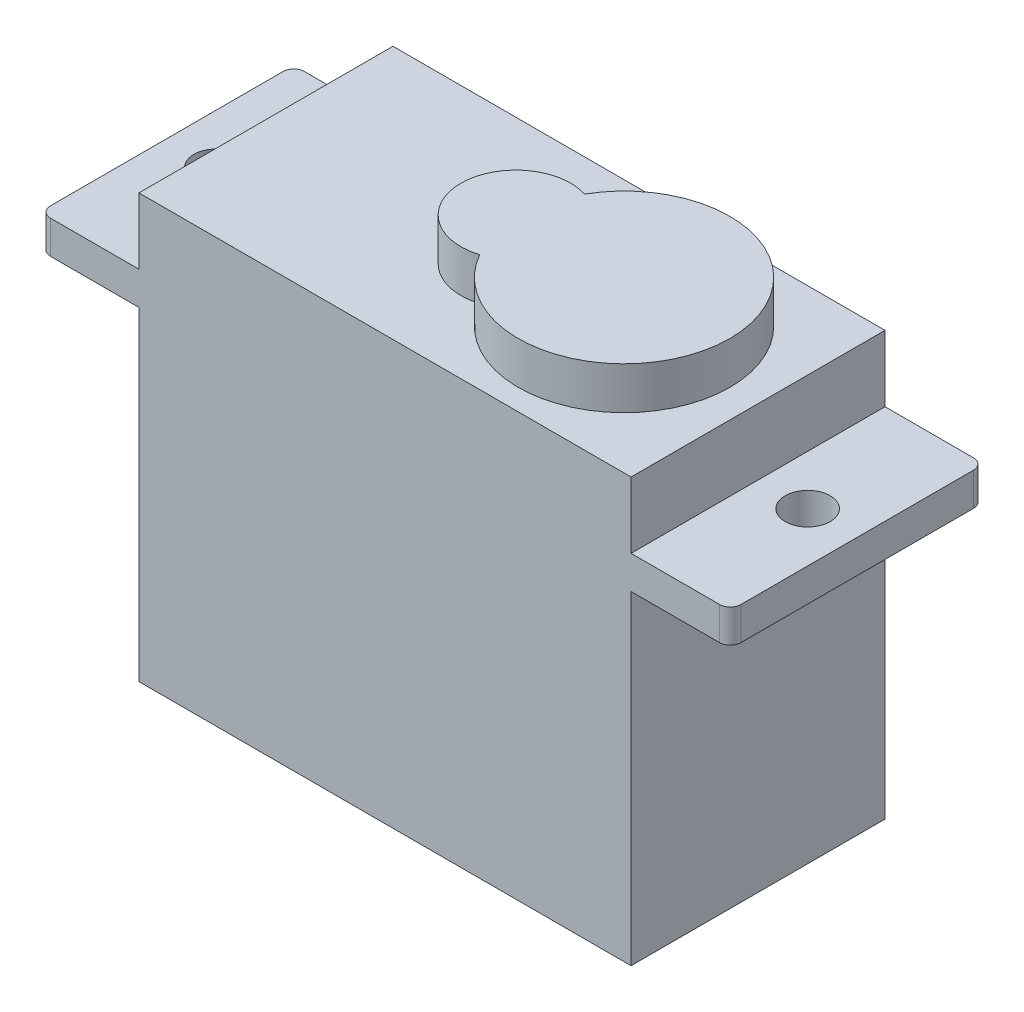
ISO-10303-21;
HEADER;
FILE_DESCRIPTION(('STEP AP214'),'2;1');
FILE_NAME('part.step','',(''),(''),'','','');
FILE_SCHEMA(('AUTOMOTIVE_DESIGN { 1 0 10303 214 1 1 1 1 }'));
ENDSEC;
DATA;
#1=APPLICATION_CONTEXT('core data for automotive mechanical design processes');
#2=APPLICATION_PROTOCOL_DEFINITION('international standard','automotive_design',2000,#1);
#3=PRODUCT_CONTEXT('',#1,'mechanical');
#4=PRODUCT('Part','Part','',(#3));
#5=PRODUCT_RELATED_PRODUCT_CATEGORY('part','',(#4));
#6=PRODUCT_DEFINITION_FORMATION('','',#4);
#7=PRODUCT_DEFINITION_CONTEXT('part definition',#1,'design');
#8=PRODUCT_DEFINITION('design','',#6,#7);
#9=PRODUCT_DEFINITION_SHAPE('','',#8);
#10=(LENGTH_UNIT() NAMED_UNIT(*) SI_UNIT(.MILLI.,.METRE.));
#11=(NAMED_UNIT(*) PLANE_ANGLE_UNIT() SI_UNIT($,.RADIAN.));
#12=(NAMED_UNIT(*) SI_UNIT($,.STERADIAN.) SOLID_ANGLE_UNIT());
#13=UNCERTAINTY_MEASURE_WITH_UNIT(LENGTH_MEASURE(1.E-05),#10,'distance_accuracy_value','');
#14=(GEOMETRIC_REPRESENTATION_CONTEXT(3) GLOBAL_UNCERTAINTY_ASSIGNED_CONTEXT((#13)) GLOBAL_UNIT_ASSIGNED_CONTEXT((#10,
#11,#12)) REPRESENTATION_CONTEXT('',''));
#15=CARTESIAN_POINT('',(0.,0.,0.));
#16=DIRECTION('',(0.,0.,1.));
#17=DIRECTION('',(1.,0.,0.));
#18=AXIS2_PLACEMENT_3D('',#15,#16,#17);
#19=CARTESIAN_POINT('',(-11.811,20.32,-6.096));
#20=DIRECTION('',(1.,0.,0.));
#21=DIRECTION('',(0.,0.,-1.));
#22=AXIS2_PLACEMENT_3D('',#19,#20,#21);
#23=PLANE('',#22);
#24=DIRECTION('',(0.,-1.,0.));
#25=VECTOR('',#24,1.);
#26=CARTESIAN_POINT('',(-11.811,20.32,6.096));
#27=LINE('',#26,#25);
#28=CARTESIAN_POINT('',(-11.811,15.5575,6.096));
#29=VERTEX_POINT('',#28);
#30=CARTESIAN_POINT('',(-11.811,0.,6.096));
#31=VERTEX_POINT('',#30);
#32=EDGE_CURVE('E376',#29,#31,#27,.T.);
#33=ORIENTED_EDGE('',*,*,#32,.F.);
#34=DIRECTION('',(0.,0.,-1.));
#35=VECTOR('',#34,1.);
#36=CARTESIAN_POINT('',(-11.811,15.5575,6.096));
#37=LINE('',#36,#35);
#38=CARTESIAN_POINT('',(-11.811,15.5575,-6.096));
#39=VERTEX_POINT('',#38);
#40=EDGE_CURVE('E196',#29,#39,#37,.T.);
#41=ORIENTED_EDGE('',*,*,#40,.T.);
#42=DIRECTION('',(0.,-1.,0.));
#43=VECTOR('',#42,1.);
#44=CARTESIAN_POINT('',(-11.811,20.32,-6.096));
#45=LINE('',#44,#43);
#46=CARTESIAN_POINT('',(-11.811,0.,-6.096));
#47=VERTEX_POINT('',#46);
#48=EDGE_CURVE('E203',#39,#47,#45,.T.);
#49=ORIENTED_EDGE('',*,*,#48,.T.);
#50=DIRECTION('',(0.,0.,1.));
#51=VECTOR('',#50,1.);
#52=CARTESIAN_POINT('',(-11.811,0.,-6.096));
#53=LINE('',#52,#51);
#54=EDGE_CURVE('E367',#47,#31,#53,.T.);
#55=ORIENTED_EDGE('',*,*,#54,.T.);
#56=EDGE_LOOP('',(#33,#41,#49,#55));
#57=FACE_BOUND('',#56,.T.);
#58=ADVANCED_FACE('F47',(#57),#23,.F.);
#59=CARTESIAN_POINT('',(11.811,20.32,-6.096));
#60=DIRECTION('',(-1.,0.,0.));
#61=DIRECTION('',(0.,0.,1.));
#62=AXIS2_PLACEMENT_3D('',#59,#60,#61);
#63=PLANE('',#62);
#64=DIRECTION('',(0.,0.,1.));
#65=VECTOR('',#64,1.);
#66=CARTESIAN_POINT('',(11.811,17.145,6.096));
#67=LINE('',#66,#65);
#68=CARTESIAN_POINT('',(11.811,17.145,-6.096));
#69=VERTEX_POINT('',#68);
#70=CARTESIAN_POINT('',(11.811,17.145,6.096));
#71=VERTEX_POINT('',#70);
#72=EDGE_CURVE('E300',#69,#71,#67,.T.);
#73=ORIENTED_EDGE('',*,*,#72,.F.);
#74=DIRECTION('',(0.,-1.,0.));
#75=VECTOR('',#74,1.);
#76=CARTESIAN_POINT('',(11.811,20.32,-6.096));
#77=LINE('',#76,#75);
#78=CARTESIAN_POINT('',(11.811,20.32,-6.096));
#79=VERTEX_POINT('',#78);
#80=EDGE_CURVE('E207',#79,#69,#77,.T.);
#81=ORIENTED_EDGE('',*,*,#80,.F.);
#82=DIRECTION('',(0.,0.,-1.));
#83=VECTOR('',#82,1.);
#84=CARTESIAN_POINT('',(11.811,20.32,-6.096));
#85=LINE('',#84,#83);
#86=CARTESIAN_POINT('',(11.811,20.32,6.096));
#87=VERTEX_POINT('',#86);
#88=EDGE_CURVE('E346',#87,#79,#85,.T.);
#89=ORIENTED_EDGE('',*,*,#88,.F.);
#90=DIRECTION('',(0.,-1.,0.));
#91=VECTOR('',#90,1.);
#92=CARTESIAN_POINT('',(11.811,20.32,6.096));
#93=LINE('',#92,#91);
#94=EDGE_CURVE('E373',#87,#71,#93,.T.);
#95=ORIENTED_EDGE('',*,*,#94,.T.);
#96=EDGE_LOOP('',(#73,#81,#89,#95));
#97=FACE_BOUND('',#96,.T.);
#98=ADVANCED_FACE('F416',(#97),#63,.F.);
#99=DIRECTION('',(0.,0.,-1.));
#100=VECTOR('',#99,1.);
#101=CARTESIAN_POINT('',(11.811,15.5575,6.096));
#102=LINE('',#101,#100);
#103=CARTESIAN_POINT('',(11.811,15.5575,6.096));
#104=VERTEX_POINT('',#103);
#105=CARTESIAN_POINT('',(11.811,15.5575,-6.096));
#106=VERTEX_POINT('',#105);
#107=EDGE_CURVE('E294',#104,#106,#102,.T.);
#108=ORIENTED_EDGE('',*,*,#107,.F.);
#109=CARTESIAN_POINT('',(11.811,0.,6.096));
#110=VERTEX_POINT('',#109);
#111=EDGE_CURVE('E359',#104,#110,#93,.T.);
#112=ORIENTED_EDGE('',*,*,#111,.T.);
#113=DIRECTION('',(0.,0.,-1.));
#114=VECTOR('',#113,1.);
#115=CARTESIAN_POINT('',(11.811,0.,-6.096));
#116=LINE('',#115,#114);
#117=CARTESIAN_POINT('',(11.811,0.,-6.096));
#118=VERTEX_POINT('',#117);
#119=EDGE_CURVE('E345',#110,#118,#116,.T.);
#120=ORIENTED_EDGE('',*,*,#119,.T.);
#121=EDGE_CURVE('E202',#106,#118,#77,.T.);
#122=ORIENTED_EDGE('',*,*,#121,.F.);
#123=EDGE_LOOP('',(#108,#112,#120,#122));
#124=FACE_BOUND('',#123,.T.);
#125=ADVANCED_FACE('F386',(#124),#63,.F.);
#126=CARTESIAN_POINT('',(-11.811,20.32,-6.096));
#127=DIRECTION('',(0.,0.,1.));
#128=DIRECTION('',(1.,0.,0.));
#129=AXIS2_PLACEMENT_3D('',#126,#127,#128);
#130=PLANE('',#129);
#131=DIRECTION('',(-1.,0.,0.));
#132=VECTOR('',#131,1.);
#133=CARTESIAN_POINT('',(16.5735,17.145,-6.096));
#134=LINE('',#133,#132);
#135=CARTESIAN_POINT('',(16.0655,17.145,-6.096));
#136=VERTEX_POINT('',#135);
#137=EDGE_CURVE('E313',#136,#69,#134,.T.);
#138=ORIENTED_EDGE('',*,*,#137,.F.);
#139=DIRECTION('',(0.,1.,0.));
#140=VECTOR('',#139,1.);
#141=CARTESIAN_POINT('',(16.0655,15.5575,-6.096));
#142=LINE('',#141,#140);
#143=CARTESIAN_POINT('',(16.0655,15.5575,-6.096));
#144=VERTEX_POINT('',#143);
#145=EDGE_CURVE('E244',#136,#144,#142,.F.);
#146=ORIENTED_EDGE('',*,*,#145,.T.);
#147=DIRECTION('',(-1.,0.,0.));
#148=VECTOR('',#147,1.);
#149=CARTESIAN_POINT('',(16.5735,15.5575,-6.096));
#150=LINE('',#149,#148);
#151=EDGE_CURVE('E316',#144,#106,#150,.T.);
#152=ORIENTED_EDGE('',*,*,#151,.T.);
#153=ORIENTED_EDGE('',*,*,#121,.T.);
#154=DIRECTION('',(-1.,0.,0.));
#155=VECTOR('',#154,1.);
#156=CARTESIAN_POINT('',(-11.811,0.,-6.096));
#157=LINE('',#156,#155);
#158=EDGE_CURVE('E363',#118,#47,#157,.T.);
#159=ORIENTED_EDGE('',*,*,#158,.T.);
#160=ORIENTED_EDGE('',*,*,#48,.F.);
#161=DIRECTION('',(1.,0.,0.));
#162=VECTOR('',#161,1.);
#163=CARTESIAN_POINT('',(-16.5735,15.5575,-6.096));
#164=LINE('',#163,#162);
#165=CARTESIAN_POINT('',(-16.0655,15.5575,-6.096));
#166=VERTEX_POINT('',#165);
#167=EDGE_CURVE('E186',#166,#39,#164,.T.);
#168=ORIENTED_EDGE('',*,*,#167,.F.);
#169=DIRECTION('',(0.,1.,0.));
#170=VECTOR('',#169,1.);
#171=CARTESIAN_POINT('',(-16.0655,17.145,-6.096));
#172=LINE('',#171,#170);
#173=CARTESIAN_POINT('',(-16.0655,17.145,-6.096));
#174=VERTEX_POINT('',#173);
#175=EDGE_CURVE('E182',#166,#174,#172,.T.);
#176=ORIENTED_EDGE('',*,*,#175,.T.);
#177=DIRECTION('',(1.,0.,0.));
#178=VECTOR('',#177,1.);
#179=CARTESIAN_POINT('',(-16.5735,17.145,-6.096));
#180=LINE('',#179,#178);
#181=CARTESIAN_POINT('',(-11.811,17.145,-6.096));
#182=VERTEX_POINT('',#181);
#183=EDGE_CURVE('E173',#174,#182,#180,.T.);
#184=ORIENTED_EDGE('',*,*,#183,.T.);
#185=CARTESIAN_POINT('',(-11.811,20.32,-6.096));
#186=VERTEX_POINT('',#185);
#187=EDGE_CURVE('E178',#186,#182,#45,.T.);
#188=ORIENTED_EDGE('',*,*,#187,.F.);
#189=DIRECTION('',(-1.,0.,0.));
#190=VECTOR('',#189,1.);
#191=CARTESIAN_POINT('',(-11.811,20.32,-6.096));
#192=LINE('',#191,#190);
#193=EDGE_CURVE('E350',#79,#186,#192,.T.);
#194=ORIENTED_EDGE('',*,*,#193,.F.);
#195=ORIENTED_EDGE('',*,*,#80,.T.);
#196=EDGE_LOOP('',(#138,#146,#152,#153,#159,#160,#168,#176,#184,#188,#194,#195));
#197=FACE_BOUND('',#196,.T.);
#198=ADVANCED_FACE('F176',(#197),#130,.F.);
#199=ORIENTED_EDGE('',*,*,#187,.T.);
#200=DIRECTION('',(0.,0.,1.));
#201=VECTOR('',#200,1.);
#202=CARTESIAN_POINT('',(-11.811,17.145,6.096));
#203=LINE('',#202,#201);
#204=CARTESIAN_POINT('',(-11.811,17.145,6.096));
#205=VERTEX_POINT('',#204);
#206=EDGE_CURVE('E189',#182,#205,#203,.T.);
#207=ORIENTED_EDGE('',*,*,#206,.T.);
#208=CARTESIAN_POINT('',(-11.811,20.32,6.096));
#209=VERTEX_POINT('',#208);
#210=EDGE_CURVE('E209',#209,#205,#27,.T.);
#211=ORIENTED_EDGE('',*,*,#210,.F.);
#212=DIRECTION('',(0.,0.,1.));
#213=VECTOR('',#212,1.);
#214=CARTESIAN_POINT('',(-11.811,20.32,-6.096));
#215=LINE('',#214,#213);
#216=EDGE_CURVE('E200',#186,#209,#215,.T.);
#217=ORIENTED_EDGE('',*,*,#216,.F.);
#218=EDGE_LOOP('',(#199,#207,#211,#217));
#219=FACE_BOUND('',#218,.T.);
#220=ADVANCED_FACE('F199',(#219),#23,.F.);
#221=CARTESIAN_POINT('',(-11.811,20.32,6.096));
#222=DIRECTION('',(0.,0.,-1.));
#223=DIRECTION('',(-1.,0.,0.));
#224=AXIS2_PLACEMENT_3D('',#221,#222,#223);
#225=PLANE('',#224);
#226=DIRECTION('',(-1.,0.,0.));
#227=VECTOR('',#226,1.);
#228=CARTESIAN_POINT('',(16.5735,15.5575,6.096));
#229=LINE('',#228,#227);
#230=CARTESIAN_POINT('',(16.0655,15.5575,6.096));
#231=VERTEX_POINT('',#230);
#232=EDGE_CURVE('E319',#231,#104,#229,.T.);
#233=ORIENTED_EDGE('',*,*,#232,.F.);
#234=DIRECTION('',(0.,-1.,0.));
#235=VECTOR('',#234,1.);
#236=CARTESIAN_POINT('',(16.0655,17.145,6.096));
#237=LINE('',#236,#235);
#238=CARTESIAN_POINT('',(16.0655,17.145,6.096));
#239=VERTEX_POINT('',#238);
#240=EDGE_CURVE('E233',#231,#239,#237,.F.);
#241=ORIENTED_EDGE('',*,*,#240,.T.);
#242=DIRECTION('',(-1.,0.,0.));
#243=VECTOR('',#242,1.);
#244=CARTESIAN_POINT('',(16.5735,17.145,6.096));
#245=LINE('',#244,#243);
#246=EDGE_CURVE('E304',#239,#71,#245,.T.);
#247=ORIENTED_EDGE('',*,*,#246,.T.);
#248=ORIENTED_EDGE('',*,*,#94,.F.);
#249=DIRECTION('',(1.,0.,0.));
#250=VECTOR('',#249,1.);
#251=CARTESIAN_POINT('',(-11.811,20.32,6.096));
#252=LINE('',#251,#250);
#253=EDGE_CURVE('E356',#209,#87,#252,.T.);
#254=ORIENTED_EDGE('',*,*,#253,.F.);
#255=ORIENTED_EDGE('',*,*,#210,.T.);
#256=DIRECTION('',(1.,0.,0.));
#257=VECTOR('',#256,1.);
#258=CARTESIAN_POINT('',(-16.5735,17.145,6.096));
#259=LINE('',#258,#257);
#260=CARTESIAN_POINT('',(-16.0655,17.145,6.096));
#261=VERTEX_POINT('',#260);
#262=EDGE_CURVE('E185',#261,#205,#259,.T.);
#263=ORIENTED_EDGE('',*,*,#262,.F.);
#264=DIRECTION('',(0.,-1.,0.));
#265=VECTOR('',#264,1.);
#266=CARTESIAN_POINT('',(-16.0655,15.5575,6.096));
#267=LINE('',#266,#265);
#268=CARTESIAN_POINT('',(-16.0655,15.5575,6.096));
#269=VERTEX_POINT('',#268);
#270=EDGE_CURVE('E229',#261,#269,#267,.T.);
#271=ORIENTED_EDGE('',*,*,#270,.T.);
#272=DIRECTION('',(1.,0.,0.));
#273=VECTOR('',#272,1.);
#274=CARTESIAN_POINT('',(-16.5735,15.5575,6.096));
#275=LINE('',#274,#273);
#276=EDGE_CURVE('E271',#269,#29,#275,.T.);
#277=ORIENTED_EDGE('',*,*,#276,.T.);
#278=ORIENTED_EDGE('',*,*,#32,.T.);
#279=DIRECTION('',(1.,0.,0.));
#280=VECTOR('',#279,1.);
#281=CARTESIAN_POINT('',(-11.811,0.,6.096));
#282=LINE('',#281,#280);
#283=EDGE_CURVE('E351',#31,#110,#282,.T.);
#284=ORIENTED_EDGE('',*,*,#283,.T.);
#285=ORIENTED_EDGE('',*,*,#111,.F.);
#286=EDGE_LOOP('',(#233,#241,#247,#248,#254,#255,#263,#271,#277,#278,#284,#285));
#287=FACE_BOUND('',#286,.T.);
#288=ADVANCED_FACE('F270',(#287),#225,.F.);
#289=CARTESIAN_POINT('',(0.,20.32,0.));
#290=DIRECTION('',(0.,1.,0.));
#291=DIRECTION('',(0.,0.,1.));
#292=AXIS2_PLACEMENT_3D('',#289,#290,#291);
#293=PLANE('',#292);
#294=CARTESIAN_POINT('',(5.37870803632484,20.32,0.));
#295=DIRECTION('',(0.,1.,0.));
#296=DIRECTION('',(0.,0.,1.));
#297=AXIS2_PLACEMENT_3D('',#294,#295,#296);
#298=CIRCLE('',#297,5.08069727071189);
#299=CARTESIAN_POINT('',(0.966939792547012,20.32,2.51987811606291));
#300=VERTEX_POINT('',#299);
#301=CARTESIAN_POINT('',(0.966939792547012,20.32,-2.51987811606291));
#302=VERTEX_POINT('',#301);
#303=EDGE_CURVE('E322',#300,#302,#298,.T.);
#304=ORIENTED_EDGE('',*,*,#303,.F.);
#305=CARTESIAN_POINT('',(0.184171776124173,20.32,0.));
#306=DIRECTION('',(0.,1.,0.));
#307=DIRECTION('',(0.,0.,1.));
#308=AXIS2_PLACEMENT_3D('',#305,#306,#307);
#309=CIRCLE('',#308,2.63865713713383);
#310=EDGE_CURVE('E328',#302,#300,#309,.T.);
#311=ORIENTED_EDGE('',*,*,#310,.F.);
#312=EDGE_LOOP('',(#304,#311));
#313=FACE_BOUND('',#312,.T.);
#314=ORIENTED_EDGE('',*,*,#88,.T.);
#315=ORIENTED_EDGE('',*,*,#193,.T.);
#316=ORIENTED_EDGE('',*,*,#216,.T.);
#317=ORIENTED_EDGE('',*,*,#253,.T.);
#318=EDGE_LOOP('',(#314,#315,#316,#317));
#319=FACE_BOUND('',#318,.T.);
#320=ADVANCED_FACE('F418',(#313,#319),#293,.T.);
#321=CARTESIAN_POINT('',(0.,0.,0.));
#322=DIRECTION('',(0.,1.,0.));
#323=DIRECTION('',(0.,0.,1.));
#324=AXIS2_PLACEMENT_3D('',#321,#322,#323);
#325=PLANE('',#324);
#326=ORIENTED_EDGE('',*,*,#119,.F.);
#327=ORIENTED_EDGE('',*,*,#283,.F.);
#328=ORIENTED_EDGE('',*,*,#54,.F.);
#329=ORIENTED_EDGE('',*,*,#158,.F.);
#330=EDGE_LOOP('',(#326,#327,#328,#329));
#331=FACE_BOUND('',#330,.T.);
#332=ADVANCED_FACE('F393',(#331),#325,.F.);
#333=CARTESIAN_POINT('',(5.37870803632484,22.352,0.));
#334=DIRECTION('',(0.,-1.,0.));
#335=DIRECTION('',(0.,0.,-1.));
#336=AXIS2_PLACEMENT_3D('',#333,#334,#335);
#337=CYLINDRICAL_SURFACE('',#336,5.08069727071189);
#338=ORIENTED_EDGE('',*,*,#303,.T.);
#339=DIRECTION('',(0.,-1.,0.));
#340=VECTOR('',#339,1.);
#341=CARTESIAN_POINT('',(0.966939792547012,22.352,-2.51987811606291));
#342=LINE('',#341,#340);
#343=CARTESIAN_POINT('',(0.966939792547012,22.352,-2.51987811606291));
#344=VERTEX_POINT('',#343);
#345=EDGE_CURVE('E341',#344,#302,#342,.T.);
#346=ORIENTED_EDGE('',*,*,#345,.F.);
#347=CARTESIAN_POINT('',(5.37870803632484,22.352,0.));
#348=DIRECTION('',(0.,1.,0.));
#349=DIRECTION('',(0.,0.,1.));
#350=AXIS2_PLACEMENT_3D('',#347,#348,#349);
#351=CIRCLE('',#350,5.08069727071189);
#352=CARTESIAN_POINT('',(0.966939792547012,22.352,2.51987811606291));
#353=VERTEX_POINT('',#352);
#354=EDGE_CURVE('E323',#353,#344,#351,.T.);
#355=ORIENTED_EDGE('',*,*,#354,.F.);
#356=DIRECTION('',(0.,-1.,0.));
#357=VECTOR('',#356,1.);
#358=CARTESIAN_POINT('',(0.966939792547012,22.352,2.51987811606291));
#359=LINE('',#358,#357);
#360=EDGE_CURVE('E331',#353,#300,#359,.T.);
#361=ORIENTED_EDGE('',*,*,#360,.T.);
#362=EDGE_LOOP('',(#338,#346,#355,#361));
#363=FACE_BOUND('',#362,.T.);
#364=ADVANCED_FACE('F428',(#363),#337,.T.);
#365=CARTESIAN_POINT('',(0.184171776124173,22.352,0.));
#366=DIRECTION('',(0.,-1.,0.));
#367=DIRECTION('',(0.,0.,-1.));
#368=AXIS2_PLACEMENT_3D('',#365,#366,#367);
#369=CYLINDRICAL_SURFACE('',#368,2.63865713713383);
#370=ORIENTED_EDGE('',*,*,#310,.T.);
#371=ORIENTED_EDGE('',*,*,#360,.F.);
#372=CARTESIAN_POINT('',(0.184171776124173,22.352,0.));
#373=DIRECTION('',(0.,1.,0.));
#374=DIRECTION('',(0.,0.,1.));
#375=AXIS2_PLACEMENT_3D('',#372,#373,#374);
#376=CIRCLE('',#375,2.63865713713383);
#377=EDGE_CURVE('E327',#344,#353,#376,.T.);
#378=ORIENTED_EDGE('',*,*,#377,.F.);
#379=ORIENTED_EDGE('',*,*,#345,.T.);
#380=EDGE_LOOP('',(#370,#371,#378,#379));
#381=FACE_BOUND('',#380,.T.);
#382=ADVANCED_FACE('F499',(#381),#369,.T.);
#383=CARTESIAN_POINT('',(0.,22.352,0.));
#384=DIRECTION('',(0.,1.,0.));
#385=DIRECTION('',(0.,0.,1.));
#386=AXIS2_PLACEMENT_3D('',#383,#384,#385);
#387=PLANE('',#386);
#388=ORIENTED_EDGE('',*,*,#354,.T.);
#389=ORIENTED_EDGE('',*,*,#377,.T.);
#390=EDGE_LOOP('',(#388,#389));
#391=FACE_BOUND('',#390,.T.);
#392=ADVANCED_FACE('F495',(#391),#387,.T.);
#393=CARTESIAN_POINT('',(16.5735,15.5575,6.096));
#394=DIRECTION('',(0.,1.,0.));
#395=DIRECTION('',(0.,0.,1.));
#396=AXIS2_PLACEMENT_3D('',#393,#394,#395);
#397=PLANE('',#396);
#398=CARTESIAN_POINT('',(14.19225,15.5575,0.));
#399=DIRECTION('',(0.,1.,0.));
#400=DIRECTION('',(0.,0.,1.));
#401=AXIS2_PLACEMENT_3D('',#398,#399,#400);
#402=CIRCLE('',#401,1.0795);
#403=CARTESIAN_POINT('',(14.19225,15.5575,1.0795));
#404=VERTEX_POINT('',#403);
#405=EDGE_CURVE('E290',#404,#404,#402,.F.);
#406=ORIENTED_EDGE('',*,*,#405,.F.);
#407=EDGE_LOOP('',(#406));
#408=FACE_BOUND('',#407,.T.);
#409=DIRECTION('',(0.,0.,-1.));
#410=VECTOR('',#409,1.);
#411=CARTESIAN_POINT('',(16.5735,15.5575,6.096));
#412=LINE('',#411,#410);
#413=CARTESIAN_POINT('',(16.5735,15.5575,5.588));
#414=VERTEX_POINT('',#413);
#415=CARTESIAN_POINT('',(16.5735,15.5575,-5.588));
#416=VERTEX_POINT('',#415);
#417=EDGE_CURVE('E295',#414,#416,#412,.T.);
#418=ORIENTED_EDGE('',*,*,#417,.F.);
#419=CARTESIAN_POINT('',(16.0655,15.5575,5.588));
#420=DIRECTION('',(0.,1.,0.));
#421=DIRECTION('',(0.,0.,1.));
#422=AXIS2_PLACEMENT_3D('',#419,#420,#421);
#423=CIRCLE('',#422,0.508);
#424=EDGE_CURVE('E226',#414,#231,#423,.F.);
#425=ORIENTED_EDGE('',*,*,#424,.T.);
#426=ORIENTED_EDGE('',*,*,#232,.T.);
#427=ORIENTED_EDGE('',*,*,#107,.T.);
#428=ORIENTED_EDGE('',*,*,#151,.F.);
#429=CARTESIAN_POINT('',(16.0655,15.5575,-5.588));
#430=DIRECTION('',(0.,1.,0.));
#431=DIRECTION('',(0.,0.,1.));
#432=AXIS2_PLACEMENT_3D('',#429,#430,#431);
#433=CIRCLE('',#432,0.508);
#434=EDGE_CURVE('E223',#144,#416,#433,.F.);
#435=ORIENTED_EDGE('',*,*,#434,.T.);
#436=EDGE_LOOP('',(#418,#425,#426,#427,#428,#435));
#437=FACE_BOUND('',#436,.T.);
#438=ADVANCED_FACE('F398',(#408,#437),#397,.F.);
#439=CARTESIAN_POINT('',(16.5735,17.145,6.096));
#440=DIRECTION('',(0.,-1.,0.));
#441=DIRECTION('',(0.,0.,-1.));
#442=AXIS2_PLACEMENT_3D('',#439,#440,#441);
#443=PLANE('',#442);
#444=CARTESIAN_POINT('',(14.19225,17.145,0.));
#445=DIRECTION('',(0.,1.,0.));
#446=DIRECTION('',(0.,0.,1.));
#447=AXIS2_PLACEMENT_3D('',#444,#445,#446);
#448=CIRCLE('',#447,1.0795);
#449=CARTESIAN_POINT('',(14.19225,17.145,1.0795));
#450=VERTEX_POINT('',#449);
#451=EDGE_CURVE('E286',#450,#450,#448,.T.);
#452=ORIENTED_EDGE('',*,*,#451,.F.);
#453=EDGE_LOOP('',(#452));
#454=FACE_BOUND('',#453,.T.);
#455=ORIENTED_EDGE('',*,*,#246,.F.);
#456=CARTESIAN_POINT('',(16.0655,17.145,5.588));
#457=DIRECTION('',(0.,-1.,0.));
#458=DIRECTION('',(0.,0.,-1.));
#459=AXIS2_PLACEMENT_3D('',#456,#457,#458);
#460=CIRCLE('',#459,0.508);
#461=CARTESIAN_POINT('',(16.5735,17.145,5.588));
#462=VERTEX_POINT('',#461);
#463=EDGE_CURVE('E239',#239,#462,#460,.F.);
#464=ORIENTED_EDGE('',*,*,#463,.T.);
#465=DIRECTION('',(0.,0.,1.));
#466=VECTOR('',#465,1.);
#467=CARTESIAN_POINT('',(16.5735,17.145,6.096));
#468=LINE('',#467,#466);
#469=CARTESIAN_POINT('',(16.5735,17.145,-5.588));
#470=VERTEX_POINT('',#469);
#471=EDGE_CURVE('E299',#470,#462,#468,.T.);
#472=ORIENTED_EDGE('',*,*,#471,.F.);
#473=CARTESIAN_POINT('',(16.0655,17.145,-5.588));
#474=DIRECTION('',(0.,-1.,0.));
#475=DIRECTION('',(0.,0.,-1.));
#476=AXIS2_PLACEMENT_3D('',#473,#474,#475);
#477=CIRCLE('',#476,0.508);
#478=EDGE_CURVE('E236',#470,#136,#477,.F.);
#479=ORIENTED_EDGE('',*,*,#478,.T.);
#480=ORIENTED_EDGE('',*,*,#137,.T.);
#481=ORIENTED_EDGE('',*,*,#72,.T.);
#482=EDGE_LOOP('',(#455,#464,#472,#479,#480,#481));
#483=FACE_BOUND('',#482,.T.);
#484=ADVANCED_FACE('F408',(#454,#483),#443,.F.);
#485=CARTESIAN_POINT('',(16.5735,0.,0.));
#486=DIRECTION('',(1.,0.,0.));
#487=DIRECTION('',(0.,0.,-1.));
#488=AXIS2_PLACEMENT_3D('',#485,#486,#487);
#489=PLANE('',#488);
#490=ORIENTED_EDGE('',*,*,#471,.T.);
#491=DIRECTION('',(0.,-1.,0.));
#492=VECTOR('',#491,1.);
#493=CARTESIAN_POINT('',(16.5735,15.5575,5.588));
#494=LINE('',#493,#492);
#495=EDGE_CURVE('E219',#462,#414,#494,.T.);
#496=ORIENTED_EDGE('',*,*,#495,.T.);
#497=ORIENTED_EDGE('',*,*,#417,.T.);
#498=DIRECTION('',(0.,1.,0.));
#499=VECTOR('',#498,1.);
#500=CARTESIAN_POINT('',(16.5735,17.145,-5.588));
#501=LINE('',#500,#499);
#502=EDGE_CURVE('E215',#416,#470,#501,.T.);
#503=ORIENTED_EDGE('',*,*,#502,.T.);
#504=EDGE_LOOP('',(#490,#496,#497,#503));
#505=FACE_BOUND('',#504,.T.);
#506=ADVANCED_FACE('F410',(#505),#489,.T.);
#507=CARTESIAN_POINT('',(14.19225,-0.001000000000001,0.));
#508=DIRECTION('',(0.,1.,0.));
#509=DIRECTION('',(0.,0.,1.));
#510=AXIS2_PLACEMENT_3D('',#507,#508,#509);
#511=CYLINDRICAL_SURFACE('',#510,1.0795);
#512=ORIENTED_EDGE('',*,*,#451,.T.);
#513=EDGE_LOOP('',(#512));
#514=FACE_BOUND('',#513,.T.);
#515=ORIENTED_EDGE('',*,*,#405,.T.);
#516=EDGE_LOOP('',(#515));
#517=FACE_BOUND('',#516,.T.);
#518=ADVANCED_FACE('F485',(#514,#517),#511,.F.);
#519=CARTESIAN_POINT('',(-16.5735,17.145,6.096));
#520=DIRECTION('',(0.,1.,0.));
#521=DIRECTION('',(0.,0.,1.));
#522=AXIS2_PLACEMENT_3D('',#519,#520,#521);
#523=PLANE('',#522);
#524=CARTESIAN_POINT('',(-14.19225,17.145,0.));
#525=DIRECTION('',(0.,-1.,0.));
#526=DIRECTION('',(0.,0.,1.));
#527=AXIS2_PLACEMENT_3D('',#524,#525,#526);
#528=CIRCLE('',#527,1.0795);
#529=CARTESIAN_POINT('',(-14.19225,17.145,1.0795));
#530=VERTEX_POINT('',#529);
#531=EDGE_CURVE('E466',#530,#530,#528,.T.);
#532=ORIENTED_EDGE('',*,*,#531,.T.);
#533=EDGE_LOOP('',(#532));
#534=FACE_BOUND('',#533,.T.);
#535=ORIENTED_EDGE('',*,*,#183,.F.);
#536=CARTESIAN_POINT('',(-16.0655,17.145,-5.588));
#537=DIRECTION('',(0.,1.,0.));
#538=DIRECTION('',(0.,0.,1.));
#539=AXIS2_PLACEMENT_3D('',#536,#537,#538);
#540=CIRCLE('',#539,0.508);
#541=CARTESIAN_POINT('',(-16.5735,17.145,-5.588));
#542=VERTEX_POINT('',#541);
#543=EDGE_CURVE('E250',#174,#542,#540,.T.);
#544=ORIENTED_EDGE('',*,*,#543,.T.);
#545=DIRECTION('',(0.,0.,1.));
#546=VECTOR('',#545,1.);
#547=CARTESIAN_POINT('',(-16.5735,17.145,6.096));
#548=LINE('',#547,#546);
#549=CARTESIAN_POINT('',(-16.5735,17.145,5.588));
#550=VERTEX_POINT('',#549);
#551=EDGE_CURVE('E261',#542,#550,#548,.T.);
#552=ORIENTED_EDGE('',*,*,#551,.T.);
#553=CARTESIAN_POINT('',(-16.0655,17.145,5.588));
#554=DIRECTION('',(0.,1.,0.));
#555=DIRECTION('',(0.,0.,1.));
#556=AXIS2_PLACEMENT_3D('',#553,#554,#555);
#557=CIRCLE('',#556,0.508);
#558=EDGE_CURVE('E247',#550,#261,#557,.T.);
#559=ORIENTED_EDGE('',*,*,#558,.T.);
#560=ORIENTED_EDGE('',*,*,#262,.T.);
#561=ORIENTED_EDGE('',*,*,#206,.F.);
#562=EDGE_LOOP('',(#535,#544,#552,#559,#560,#561));
#563=FACE_BOUND('',#562,.T.);
#564=ADVANCED_FACE('F190',(#534,#563),#523,.T.);
#565=CARTESIAN_POINT('',(-16.5735,15.5575,6.096));
#566=DIRECTION('',(0.,-1.,0.));
#567=DIRECTION('',(0.,0.,-1.));
#568=AXIS2_PLACEMENT_3D('',#565,#566,#567);
#569=PLANE('',#568);
#570=CARTESIAN_POINT('',(-14.19225,15.5575,0.));
#571=DIRECTION('',(0.,-1.,0.));
#572=DIRECTION('',(0.,0.,-1.));
#573=AXIS2_PLACEMENT_3D('',#570,#571,#572);
#574=CIRCLE('',#573,1.0795);
#575=CARTESIAN_POINT('',(-14.19225,15.5575,-1.0795));
#576=VERTEX_POINT('',#575);
#577=EDGE_CURVE('E197',#576,#576,#574,.T.);
#578=ORIENTED_EDGE('',*,*,#577,.F.);
#579=EDGE_LOOP('',(#578));
#580=FACE_BOUND('',#579,.T.);
#581=DIRECTION('',(0.,0.,-1.));
#582=VECTOR('',#581,1.);
#583=CARTESIAN_POINT('',(-16.5735,15.5575,6.096));
#584=LINE('',#583,#582);
#585=CARTESIAN_POINT('',(-16.5735,15.5575,5.588));
#586=VERTEX_POINT('',#585);
#587=CARTESIAN_POINT('',(-16.5735,15.5575,-5.588));
#588=VERTEX_POINT('',#587);
#589=EDGE_CURVE('E262',#586,#588,#584,.T.);
#590=ORIENTED_EDGE('',*,*,#589,.T.);
#591=CARTESIAN_POINT('',(-16.0655,15.5575,-5.588));
#592=DIRECTION('',(0.,-1.,0.));
#593=DIRECTION('',(0.,0.,-1.));
#594=AXIS2_PLACEMENT_3D('',#591,#592,#593);
#595=CIRCLE('',#594,0.508);
#596=EDGE_CURVE('E11',#588,#166,#595,.T.);
#597=ORIENTED_EDGE('',*,*,#596,.T.);
#598=ORIENTED_EDGE('',*,*,#167,.T.);
#599=ORIENTED_EDGE('',*,*,#40,.F.);
#600=ORIENTED_EDGE('',*,*,#276,.F.);
#601=CARTESIAN_POINT('',(-16.0655,15.5575,5.588));
#602=DIRECTION('',(0.,-1.,0.));
#603=DIRECTION('',(0.,0.,-1.));
#604=AXIS2_PLACEMENT_3D('',#601,#602,#603);
#605=CIRCLE('',#604,0.508);
#606=EDGE_CURVE('E56',#269,#586,#605,.T.);
#607=ORIENTED_EDGE('',*,*,#606,.T.);
#608=EDGE_LOOP('',(#590,#597,#598,#599,#600,#607));
#609=FACE_BOUND('',#608,.T.);
#610=ADVANCED_FACE('F273',(#580,#609),#569,.T.);
#611=CARTESIAN_POINT('',(-16.5735,0.,0.));
#612=DIRECTION('',(-1.,0.,0.));
#613=DIRECTION('',(0.,0.,-1.));
#614=AXIS2_PLACEMENT_3D('',#611,#612,#613);
#615=PLANE('',#614);
#616=ORIENTED_EDGE('',*,*,#551,.F.);
#617=DIRECTION('',(0.,1.,0.));
#618=VECTOR('',#617,1.);
#619=CARTESIAN_POINT('',(-16.5735,15.5575,-5.588));
#620=LINE('',#619,#618);
#621=EDGE_CURVE('E63',#542,#588,#620,.F.);
#622=ORIENTED_EDGE('',*,*,#621,.T.);
#623=ORIENTED_EDGE('',*,*,#589,.F.);
#624=DIRECTION('',(0.,-1.,0.));
#625=VECTOR('',#624,1.);
#626=CARTESIAN_POINT('',(-16.5735,17.145,5.588));
#627=LINE('',#626,#625);
#628=EDGE_CURVE('E253',#586,#550,#627,.F.);
#629=ORIENTED_EDGE('',*,*,#628,.T.);
#630=EDGE_LOOP('',(#616,#622,#623,#629));
#631=FACE_BOUND('',#630,.T.);
#632=ADVANCED_FACE('F260',(#631),#615,.T.);
#633=CARTESIAN_POINT('',(-14.19225,-0.001000000000001,0.));
#634=DIRECTION('',(0.,1.,0.));
#635=DIRECTION('',(0.,0.,1.));
#636=AXIS2_PLACEMENT_3D('',#633,#634,#635);
#637=CYLINDRICAL_SURFACE('',#636,1.0795);
#638=ORIENTED_EDGE('',*,*,#577,.T.);
#639=EDGE_LOOP('',(#638));
#640=FACE_BOUND('',#639,.T.);
#641=ORIENTED_EDGE('',*,*,#531,.F.);
#642=EDGE_LOOP('',(#641));
#643=FACE_BOUND('',#642,.T.);
#644=ADVANCED_FACE('F453',(#640,#643),#637,.F.);
#645=CARTESIAN_POINT('',(16.0655,0.,5.588));
#646=DIRECTION('',(0.,1.,0.));
#647=DIRECTION('',(0.,0.,1.));
#648=AXIS2_PLACEMENT_3D('',#645,#646,#647);
#649=CYLINDRICAL_SURFACE('',#648,0.508);
#650=ORIENTED_EDGE('',*,*,#463,.F.);
#651=ORIENTED_EDGE('',*,*,#240,.F.);
#652=ORIENTED_EDGE('',*,*,#424,.F.);
#653=ORIENTED_EDGE('',*,*,#495,.F.);
#654=EDGE_LOOP('',(#650,#651,#652,#653));
#655=FACE_BOUND('',#654,.T.);
#656=ADVANCED_FACE('F404',(#655),#649,.T.);
#657=CARTESIAN_POINT('',(16.0655,0.,-5.588));
#658=DIRECTION('',(0.,-1.,0.));
#659=DIRECTION('',(0.,0.,-1.));
#660=AXIS2_PLACEMENT_3D('',#657,#658,#659);
#661=CYLINDRICAL_SURFACE('',#660,0.508);
#662=ORIENTED_EDGE('',*,*,#434,.F.);
#663=ORIENTED_EDGE('',*,*,#145,.F.);
#664=ORIENTED_EDGE('',*,*,#478,.F.);
#665=ORIENTED_EDGE('',*,*,#502,.F.);
#666=EDGE_LOOP('',(#662,#663,#664,#665));
#667=FACE_BOUND('',#666,.T.);
#668=ADVANCED_FACE('F413',(#667),#661,.T.);
#669=CARTESIAN_POINT('',(-16.0655,20.32,-5.588));
#670=DIRECTION('',(0.,-1.,0.));
#671=DIRECTION('',(0.,0.,-1.));
#672=AXIS2_PLACEMENT_3D('',#669,#670,#671);
#673=CYLINDRICAL_SURFACE('',#672,0.508);
#674=ORIENTED_EDGE('',*,*,#596,.F.);
#675=ORIENTED_EDGE('',*,*,#621,.F.);
#676=ORIENTED_EDGE('',*,*,#543,.F.);
#677=ORIENTED_EDGE('',*,*,#175,.F.);
#678=EDGE_LOOP('',(#674,#675,#676,#677));
#679=FACE_BOUND('',#678,.T.);
#680=ADVANCED_FACE('F455',(#679),#673,.T.);
#681=CARTESIAN_POINT('',(-16.0655,20.32,5.588));
#682=DIRECTION('',(0.,1.,0.));
#683=DIRECTION('',(0.,0.,1.));
#684=AXIS2_PLACEMENT_3D('',#681,#682,#683);
#685=CYLINDRICAL_SURFACE('',#684,0.508);
#686=ORIENTED_EDGE('',*,*,#558,.F.);
#687=ORIENTED_EDGE('',*,*,#628,.F.);
#688=ORIENTED_EDGE('',*,*,#606,.F.);
#689=ORIENTED_EDGE('',*,*,#270,.F.);
#690=EDGE_LOOP('',(#686,#687,#688,#689));
#691=FACE_BOUND('',#690,.T.);
#692=ADVANCED_FACE('F49',(#691),#685,.T.);
#693=CLOSED_SHELL('',(#58,#98,#125,#198,#220,#288,#320,#332,#364,#382,#392,#438,#484,#506,#518,
#564,#610,#632,#644,#656,#668,#680,#692));
#694=MANIFOLD_SOLID_BREP('B2',#693);
#695=ADVANCED_BREP_SHAPE_REPRESENTATION('',(#18,#694),#14);
#696=SHAPE_DEFINITION_REPRESENTATION(#9,#695);
ENDSEC;
END-ISO-10303-21;
